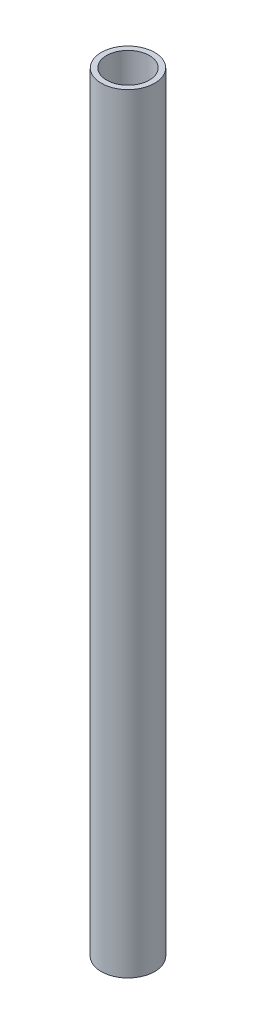
ISO-10303-21;
HEADER;
FILE_DESCRIPTION(('STEP AP214'),'2;1');
FILE_NAME('part.step','',(''),(''),'','','');
FILE_SCHEMA(('AUTOMOTIVE_DESIGN { 1 0 10303 214 1 1 1 1 }'));
ENDSEC;
DATA;
#1=APPLICATION_CONTEXT('core data for automotive mechanical design processes');
#2=APPLICATION_PROTOCOL_DEFINITION('international standard','automotive_design',2000,#1);
#3=PRODUCT_CONTEXT('',#1,'mechanical');
#4=PRODUCT('Part','Part','',(#3));
#5=PRODUCT_RELATED_PRODUCT_CATEGORY('part','',(#4));
#6=PRODUCT_DEFINITION_FORMATION('','',#4);
#7=PRODUCT_DEFINITION_CONTEXT('part definition',#1,'design');
#8=PRODUCT_DEFINITION('design','',#6,#7);
#9=PRODUCT_DEFINITION_SHAPE('','',#8);
#10=(LENGTH_UNIT() NAMED_UNIT(*) SI_UNIT(.MILLI.,.METRE.));
#11=(NAMED_UNIT(*) PLANE_ANGLE_UNIT() SI_UNIT($,.RADIAN.));
#12=(NAMED_UNIT(*) SI_UNIT($,.STERADIAN.) SOLID_ANGLE_UNIT());
#13=UNCERTAINTY_MEASURE_WITH_UNIT(LENGTH_MEASURE(1.E-05),#10,'distance_accuracy_value','');
#14=(GEOMETRIC_REPRESENTATION_CONTEXT(3) GLOBAL_UNCERTAINTY_ASSIGNED_CONTEXT((#13)) GLOBAL_UNIT_ASSIGNED_CONTEXT((#10,
#11,#12)) REPRESENTATION_CONTEXT('',''));
#15=CARTESIAN_POINT('',(0.,0.,0.));
#16=DIRECTION('',(0.,0.,1.));
#17=DIRECTION('',(1.,0.,0.));
#18=AXIS2_PLACEMENT_3D('',#15,#16,#17);
#19=CARTESIAN_POINT('',(0.,228.6,0.));
#20=DIRECTION('',(0.,1.,0.));
#21=DIRECTION('',(0.,0.,1.));
#22=AXIS2_PLACEMENT_3D('',#19,#20,#21);
#23=PLANE('',#22);
#24=CARTESIAN_POINT('',(0.,228.6,0.));
#25=DIRECTION('',(0.,1.,0.));
#26=DIRECTION('',(0.,0.,1.));
#27=AXIS2_PLACEMENT_3D('',#24,#25,#26);
#28=CIRCLE('',#27,15.875);
#29=CARTESIAN_POINT('',(0.,228.6,15.875));
#30=VERTEX_POINT('',#29);
#31=EDGE_CURVE('E10',#30,#30,#28,.T.);
#32=ORIENTED_EDGE('',*,*,#31,.T.);
#33=EDGE_LOOP('',(#32));
#34=FACE_BOUND('',#33,.T.);
#35=CARTESIAN_POINT('',(0.,228.6,0.));
#36=DIRECTION('',(0.,1.,0.));
#37=DIRECTION('',(0.,0.,1.));
#38=AXIS2_PLACEMENT_3D('',#35,#36,#37);
#39=CIRCLE('',#38,12.7);
#40=CARTESIAN_POINT('',(0.,228.6,12.7));
#41=VERTEX_POINT('',#40);
#42=EDGE_CURVE('E50',#41,#41,#39,.T.);
#43=ORIENTED_EDGE('',*,*,#42,.F.);
#44=EDGE_LOOP('',(#43));
#45=FACE_BOUND('',#44,.T.);
#46=ADVANCED_FACE('F37',(#34,#45),#23,.T.);
#47=CARTESIAN_POINT('',(0.,-228.6,0.));
#48=DIRECTION('',(0.,1.,0.));
#49=DIRECTION('',(0.,0.,1.));
#50=AXIS2_PLACEMENT_3D('',#47,#48,#49);
#51=PLANE('',#50);
#52=CARTESIAN_POINT('',(0.,-228.6,0.));
#53=DIRECTION('',(0.,1.,0.));
#54=DIRECTION('',(0.,0.,1.));
#55=AXIS2_PLACEMENT_3D('',#52,#53,#54);
#56=CIRCLE('',#55,15.875);
#57=CARTESIAN_POINT('',(0.,-228.6,15.875));
#58=VERTEX_POINT('',#57);
#59=EDGE_CURVE('E41',#58,#58,#56,.T.);
#60=ORIENTED_EDGE('',*,*,#59,.F.);
#61=EDGE_LOOP('',(#60));
#62=FACE_BOUND('',#61,.T.);
#63=CARTESIAN_POINT('',(0.,-228.6,0.));
#64=DIRECTION('',(0.,1.,0.));
#65=DIRECTION('',(0.,0.,1.));
#66=AXIS2_PLACEMENT_3D('',#63,#64,#65);
#67=CIRCLE('',#66,12.7);
#68=CARTESIAN_POINT('',(0.,-228.6,12.7));
#69=VERTEX_POINT('',#68);
#70=EDGE_CURVE('E52',#69,#69,#67,.T.);
#71=ORIENTED_EDGE('',*,*,#70,.T.);
#72=EDGE_LOOP('',(#71));
#73=FACE_BOUND('',#72,.T.);
#74=ADVANCED_FACE('F64',(#62,#73),#51,.F.);
#75=CARTESIAN_POINT('',(0.,228.6,0.));
#76=DIRECTION('',(0.,-1.,0.));
#77=DIRECTION('',(0.,0.,-1.));
#78=AXIS2_PLACEMENT_3D('',#75,#76,#77);
#79=CYLINDRICAL_SURFACE('',#78,15.875);
#80=ORIENTED_EDGE('',*,*,#31,.F.);
#81=EDGE_LOOP('',(#80));
#82=FACE_BOUND('',#81,.T.);
#83=ORIENTED_EDGE('',*,*,#59,.T.);
#84=EDGE_LOOP('',(#83));
#85=FACE_BOUND('',#84,.T.);
#86=ADVANCED_FACE('F39',(#82,#85),#79,.T.);
#87=CARTESIAN_POINT('',(0.,228.6,0.));
#88=DIRECTION('',(0.,-1.,0.));
#89=DIRECTION('',(0.,0.,-1.));
#90=AXIS2_PLACEMENT_3D('',#87,#88,#89);
#91=CYLINDRICAL_SURFACE('',#90,12.7);
#92=ORIENTED_EDGE('',*,*,#42,.T.);
#93=EDGE_LOOP('',(#92));
#94=FACE_BOUND('',#93,.T.);
#95=ORIENTED_EDGE('',*,*,#70,.F.);
#96=EDGE_LOOP('',(#95));
#97=FACE_BOUND('',#96,.T.);
#98=ADVANCED_FACE('F60',(#94,#97),#91,.F.);
#99=CLOSED_SHELL('',(#46,#74,#86,#98));
#100=MANIFOLD_SOLID_BREP('B2',#99);
#101=ADVANCED_BREP_SHAPE_REPRESENTATION('',(#18,#100),#14);
#102=SHAPE_DEFINITION_REPRESENTATION(#9,#101);
ENDSEC;
END-ISO-10303-21;
